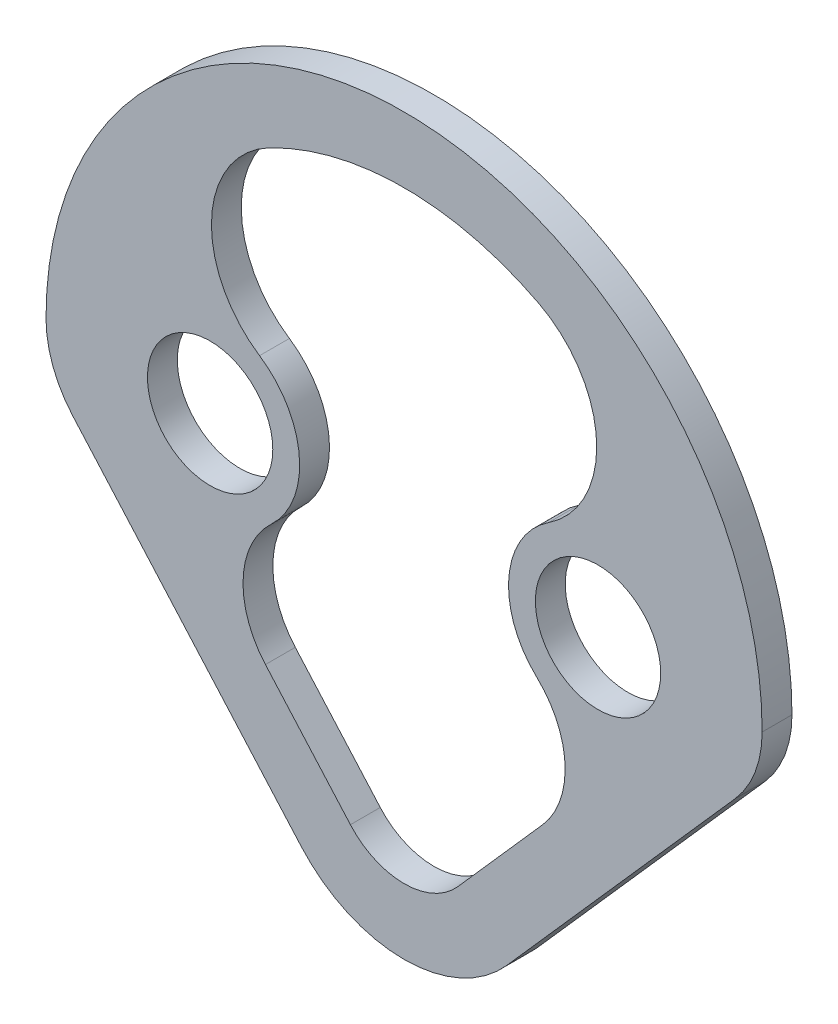
ISO-10303-21;
HEADER;
FILE_DESCRIPTION(('STEP AP214'),'2;1');
FILE_NAME('part.step','',(''),(''),'','','');
FILE_SCHEMA(('AUTOMOTIVE_DESIGN { 1 0 10303 214 1 1 1 1 }'));
ENDSEC;
DATA;
#1=APPLICATION_CONTEXT('core data for automotive mechanical design processes');
#2=APPLICATION_PROTOCOL_DEFINITION('international standard','automotive_design',2000,#1);
#3=PRODUCT_CONTEXT('',#1,'mechanical');
#4=PRODUCT('Part','Part','',(#3));
#5=PRODUCT_RELATED_PRODUCT_CATEGORY('part','',(#4));
#6=PRODUCT_DEFINITION_FORMATION('','',#4);
#7=PRODUCT_DEFINITION_CONTEXT('part definition',#1,'design');
#8=PRODUCT_DEFINITION('design','',#6,#7);
#9=PRODUCT_DEFINITION_SHAPE('','',#8);
#10=(LENGTH_UNIT() NAMED_UNIT(*) SI_UNIT(.MILLI.,.METRE.));
#11=(NAMED_UNIT(*) PLANE_ANGLE_UNIT() SI_UNIT($,.RADIAN.));
#12=(NAMED_UNIT(*) SI_UNIT($,.STERADIAN.) SOLID_ANGLE_UNIT());
#13=UNCERTAINTY_MEASURE_WITH_UNIT(LENGTH_MEASURE(1.E-05),#10,'distance_accuracy_value','');
#14=(GEOMETRIC_REPRESENTATION_CONTEXT(3) GLOBAL_UNCERTAINTY_ASSIGNED_CONTEXT((#13)) GLOBAL_UNIT_ASSIGNED_CONTEXT((#10,
#11,#12)) REPRESENTATION_CONTEXT('',''));
#15=CARTESIAN_POINT('',(0.,0.,0.));
#16=DIRECTION('',(0.,0.,1.));
#17=DIRECTION('',(1.,0.,0.));
#18=AXIS2_PLACEMENT_3D('',#15,#16,#17);
#19=CARTESIAN_POINT('',(0.,0.,5.));
#20=DIRECTION('',(0.,0.,1.));
#21=DIRECTION('',(1.,0.,0.));
#22=AXIS2_PLACEMENT_3D('',#19,#20,#21);
#23=PLANE('',#22);
#24=CARTESIAN_POINT('',(-32.5,40.,5.));
#25=DIRECTION('',(0.,0.,1.));
#26=DIRECTION('',(1.,0.,0.));
#27=AXIS2_PLACEMENT_3D('',#24,#25,#26);
#28=CIRCLE('',#27,10.5);
#29=CARTESIAN_POINT('',(-22.,40.,5.));
#30=VERTEX_POINT('',#29);
#31=EDGE_CURVE('E274',#30,#30,#28,.T.);
#32=ORIENTED_EDGE('',*,*,#31,.F.);
#33=EDGE_LOOP('',(#32));
#34=FACE_BOUND('',#33,.T.);
#35=CARTESIAN_POINT('',(0.,0.,5.));
#36=DIRECTION('',(0.,0.,1.));
#37=DIRECTION('',(1.,0.,0.));
#38=AXIS2_PLACEMENT_3D('',#35,#36,#37);
#39=CIRCLE('',#38,23.);
#40=CARTESIAN_POINT('',(-17.2388092700811,-15.2257497335851,5.));
#41=VERTEX_POINT('',#40);
#42=CARTESIAN_POINT('',(17.2388092700811,-15.2257497335851,5.));
#43=VERTEX_POINT('',#42);
#44=EDGE_CURVE('E282',#41,#43,#39,.T.);
#45=ORIENTED_EDGE('',*,*,#44,.T.);
#46=DIRECTION('',(0.661989118851527,0.749513446525264,0.));
#47=VECTOR('',#46,1.);
#48=CARTESIAN_POINT('',(17.2388092700811,-15.2257497335851,5.));
#49=LINE('',#48,#47);
#50=CARTESIAN_POINT('',(55.4912420374548,28.0841958606725,5.));
#51=VERTEX_POINT('',#50);
#52=EDGE_CURVE('E286',#43,#51,#49,.T.);
#53=ORIENTED_EDGE('',*,*,#52,.T.);
#54=CARTESIAN_POINT('',(42.0000000000007,39.9999999999997,5.));
#55=DIRECTION('',(0.,0.,1.));
#56=DIRECTION('',(-1.,0.,0.));
#57=AXIS2_PLACEMENT_3D('',#54,#55,#56);
#58=CIRCLE('',#57,17.9999999999993);
#59=CARTESIAN_POINT('',(60.,40.,5.));
#60=VERTEX_POINT('',#59);
#61=EDGE_CURVE('E290',#51,#60,#58,.T.);
#62=ORIENTED_EDGE('',*,*,#61,.T.);
#63=CARTESIAN_POINT('',(0.,40.,5.));
#64=DIRECTION('',(0.,0.,1.));
#65=DIRECTION('',(-1.,0.,0.));
#66=AXIS2_PLACEMENT_3D('',#63,#64,#65);
#67=CIRCLE('',#66,60.);
#68=CARTESIAN_POINT('',(-60.,40.,5.));
#69=VERTEX_POINT('',#68);
#70=EDGE_CURVE('E293',#60,#69,#67,.T.);
#71=ORIENTED_EDGE('',*,*,#70,.T.);
#72=CARTESIAN_POINT('',(-42.,40.,5.));
#73=DIRECTION('',(0.,0.,1.));
#74=DIRECTION('',(1.,0.,0.));
#75=AXIS2_PLACEMENT_3D('',#72,#73,#74);
#76=CIRCLE('',#75,18.);
#77=CARTESIAN_POINT('',(-55.4912420374547,28.0841958606725,5.));
#78=VERTEX_POINT('',#77);
#79=EDGE_CURVE('E296',#69,#78,#76,.T.);
#80=ORIENTED_EDGE('',*,*,#79,.T.);
#81=DIRECTION('',(0.661989118851527,-0.749513446525264,0.));
#82=VECTOR('',#81,1.);
#83=CARTESIAN_POINT('',(-17.2388092700811,-15.2257497335851,5.));
#84=LINE('',#83,#82);
#85=EDGE_CURVE('E299',#78,#41,#84,.T.);
#86=ORIENTED_EDGE('',*,*,#85,.T.);
#87=EDGE_LOOP('',(#45,#53,#62,#71,#80,#86));
#88=FACE_BOUND('',#87,.T.);
#89=CARTESIAN_POINT('',(32.5,40.,5.));
#90=DIRECTION('',(0.,0.,1.));
#91=DIRECTION('',(1.,0.,0.));
#92=AXIS2_PLACEMENT_3D('',#89,#90,#91);
#93=CIRCLE('',#92,10.5);
#94=CARTESIAN_POINT('',(43.,40.,5.));
#95=VERTEX_POINT('',#94);
#96=EDGE_CURVE('E266',#95,#95,#93,.T.);
#97=ORIENTED_EDGE('',*,*,#96,.F.);
#98=EDGE_LOOP('',(#97));
#99=FACE_BOUND('',#98,.T.);
#100=DIRECTION('',(0.661989118851527,-0.749513446525264,0.));
#101=VECTOR('',#100,1.);
#102=CARTESIAN_POINT('',(-23.232277996995,8.17672768028504,5.));
#103=LINE('',#102,#101);
#104=CARTESIAN_POINT('',(-23.232277996995,8.17672768028504,5.));
#105=VERTEX_POINT('',#104);
#106=CARTESIAN_POINT('',(-8.99416135830316,-7.94386942621832,5.));
#107=VERTEX_POINT('',#106);
#108=EDGE_CURVE('E166',#105,#107,#103,.T.);
#109=ORIENTED_EDGE('',*,*,#108,.F.);
#110=CARTESIAN_POINT('',(-11.9895762991161,18.1065644630579,5.));
#111=DIRECTION('',(0.,0.,1.));
#112=DIRECTION('',(1.,0.,0.));
#113=AXIS2_PLACEMENT_3D('',#110,#111,#112);
#114=CIRCLE('',#113,15.);
#115=CARTESIAN_POINT('',(-22.2447881495579,29.0532822315289,5.));
#116=VERTEX_POINT('',#115);
#117=EDGE_CURVE('E157',#116,#105,#114,.T.);
#118=ORIENTED_EDGE('',*,*,#117,.F.);
#119=CARTESIAN_POINT('',(-32.5,40.,5.));
#120=DIRECTION('',(0.,0.,-1.));
#121=DIRECTION('',(-1.,0.,0.));
#122=AXIS2_PLACEMENT_3D('',#119,#120,#121);
#123=CIRCLE('',#122,15.0000000000003);
#124=CARTESIAN_POINT('',(-24.2185314685311,52.5066893685859,5.));
#125=VERTEX_POINT('',#124);
#126=EDGE_CURVE('E204',#125,#116,#123,.T.);
#127=ORIENTED_EDGE('',*,*,#126,.F.);
#128=CARTESIAN_POINT('',(-14.2807692307686,67.514716610889,5.));
#129=DIRECTION('',(0.,0.,1.));
#130=DIRECTION('',(1.,0.,0.));
#131=AXIS2_PLACEMENT_3D('',#128,#129,#130);
#132=CIRCLE('',#131,18.0000000000003);
#133=CARTESIAN_POINT('',(-22.5728287841183,83.4910036752761,5.));
#134=VERTEX_POINT('',#133);
#135=EDGE_CURVE('E201',#134,#125,#132,.T.);
#136=ORIENTED_EDGE('',*,*,#135,.F.);
#137=CARTESIAN_POINT('',(0.,40.,5.));
#138=DIRECTION('',(0.,0.,1.));
#139=DIRECTION('',(1.,0.,0.));
#140=AXIS2_PLACEMENT_3D('',#137,#138,#139);
#141=CIRCLE('',#140,49.);
#142=CARTESIAN_POINT('',(22.572828784114,83.4910036752783,5.));
#143=VERTEX_POINT('',#142);
#144=EDGE_CURVE('E198',#143,#134,#141,.T.);
#145=ORIENTED_EDGE('',*,*,#144,.F.);
#146=CARTESIAN_POINT('',(14.2807692307654,67.5147166108893,5.));
#147=DIRECTION('',(0.,0.,1.));
#148=DIRECTION('',(1.,0.,0.));
#149=AXIS2_PLACEMENT_3D('',#146,#147,#148);
#150=CIRCLE('',#149,18.0000000000012);
#151=CARTESIAN_POINT('',(24.2185314685307,52.5066893685869,5.));
#152=VERTEX_POINT('',#151);
#153=EDGE_CURVE('E195',#152,#143,#150,.T.);
#154=ORIENTED_EDGE('',*,*,#153,.F.);
#155=CARTESIAN_POINT('',(32.5,40.,5.));
#156=DIRECTION('',(0.,0.,-1.));
#157=DIRECTION('',(-1.,0.,0.));
#158=AXIS2_PLACEMENT_3D('',#155,#156,#157);
#159=CIRCLE('',#158,15.0000000000014);
#160=CARTESIAN_POINT('',(22.2447881495545,29.0532822315304,5.));
#161=VERTEX_POINT('',#160);
#162=EDGE_CURVE('E192',#161,#152,#159,.T.);
#163=ORIENTED_EDGE('',*,*,#162,.F.);
#164=CARTESIAN_POINT('',(11.98957629911,18.1065644630619,5.));
#165=DIRECTION('',(0.,0.,1.));
#166=DIRECTION('',(-1.,0.,0.));
#167=AXIS2_PLACEMENT_3D('',#164,#165,#166);
#168=CIRCLE('',#167,15.);
#169=CARTESIAN_POINT('',(23.2322779969923,8.1767276802928,5.));
#170=VERTEX_POINT('',#169);
#171=EDGE_CURVE('E189',#170,#161,#168,.T.);
#172=ORIENTED_EDGE('',*,*,#171,.F.);
#173=DIRECTION('',(0.661989118851277,0.749513446525485,0.));
#174=VECTOR('',#173,1.);
#175=CARTESIAN_POINT('',(8.99416135830581,-7.94386942621531,5.));
#176=LINE('',#175,#174);
#177=CARTESIAN_POINT('',(8.99416135830582,-7.94386942621533,5.));
#178=VERTEX_POINT('',#177);
#179=EDGE_CURVE('E184',#178,#170,#176,.T.);
#180=ORIENTED_EDGE('',*,*,#179,.F.);
#181=CARTESIAN_POINT('',(0.,0.,5.));
#182=DIRECTION('',(0.,0.,1.));
#183=DIRECTION('',(1.,0.,0.));
#184=AXIS2_PLACEMENT_3D('',#181,#182,#183);
#185=CIRCLE('',#184,12.);
#186=EDGE_CURVE('E180',#107,#178,#185,.T.);
#187=ORIENTED_EDGE('',*,*,#186,.F.);
#188=EDGE_LOOP('',(#109,#118,#127,#136,#145,#154,#163,#172,#180,#187));
#189=FACE_BOUND('',#188,.T.);
#190=ADVANCED_FACE('F43',(#34,#88,#99,#189),#23,.T.);
#191=CARTESIAN_POINT('',(0.,0.,0.));
#192=DIRECTION('',(0.,0.,1.));
#193=DIRECTION('',(1.,0.,0.));
#194=AXIS2_PLACEMENT_3D('',#191,#192,#193);
#195=PLANE('',#194);
#196=CARTESIAN_POINT('',(32.5,40.,0.));
#197=DIRECTION('',(0.,0.,1.));
#198=DIRECTION('',(1.,0.,0.));
#199=AXIS2_PLACEMENT_3D('',#196,#197,#198);
#200=CIRCLE('',#199,10.5);
#201=CARTESIAN_POINT('',(43.,40.,0.));
#202=VERTEX_POINT('',#201);
#203=EDGE_CURVE('E175',#202,#202,#200,.T.);
#204=ORIENTED_EDGE('',*,*,#203,.T.);
#205=EDGE_LOOP('',(#204));
#206=FACE_BOUND('',#205,.T.);
#207=CARTESIAN_POINT('',(-32.5,40.,0.));
#208=DIRECTION('',(0.,0.,1.));
#209=DIRECTION('',(1.,0.,0.));
#210=AXIS2_PLACEMENT_3D('',#207,#208,#209);
#211=CIRCLE('',#210,10.5);
#212=CARTESIAN_POINT('',(-22.,40.,0.));
#213=VERTEX_POINT('',#212);
#214=EDGE_CURVE('E270',#213,#213,#211,.T.);
#215=ORIENTED_EDGE('',*,*,#214,.T.);
#216=EDGE_LOOP('',(#215));
#217=FACE_BOUND('',#216,.T.);
#218=CARTESIAN_POINT('',(0.,0.,0.));
#219=DIRECTION('',(0.,0.,1.));
#220=DIRECTION('',(1.,0.,0.));
#221=AXIS2_PLACEMENT_3D('',#218,#219,#220);
#222=CIRCLE('',#221,23.);
#223=CARTESIAN_POINT('',(-17.2388092700811,-15.2257497335851,0.));
#224=VERTEX_POINT('',#223);
#225=CARTESIAN_POINT('',(17.2388092700811,-15.2257497335851,0.));
#226=VERTEX_POINT('',#225);
#227=EDGE_CURVE('E278',#224,#226,#222,.T.);
#228=ORIENTED_EDGE('',*,*,#227,.F.);
#229=DIRECTION('',(0.661989118851527,-0.749513446525264,0.));
#230=VECTOR('',#229,1.);
#231=CARTESIAN_POINT('',(-17.2388092700811,-15.2257497335851,0.));
#232=LINE('',#231,#230);
#233=CARTESIAN_POINT('',(-55.4912420374547,28.0841958606725,0.));
#234=VERTEX_POINT('',#233);
#235=EDGE_CURVE('E287',#234,#224,#232,.T.);
#236=ORIENTED_EDGE('',*,*,#235,.F.);
#237=CARTESIAN_POINT('',(-42.,40.,0.));
#238=DIRECTION('',(0.,0.,1.));
#239=DIRECTION('',(1.,0.,0.));
#240=AXIS2_PLACEMENT_3D('',#237,#238,#239);
#241=CIRCLE('',#240,18.);
#242=CARTESIAN_POINT('',(-60.,40.,0.));
#243=VERTEX_POINT('',#242);
#244=EDGE_CURVE('E315',#243,#234,#241,.T.);
#245=ORIENTED_EDGE('',*,*,#244,.F.);
#246=CARTESIAN_POINT('',(0.,40.,0.));
#247=DIRECTION('',(0.,0.,1.));
#248=DIRECTION('',(-1.,0.,0.));
#249=AXIS2_PLACEMENT_3D('',#246,#247,#248);
#250=CIRCLE('',#249,60.);
#251=CARTESIAN_POINT('',(60.,40.,0.));
#252=VERTEX_POINT('',#251);
#253=EDGE_CURVE('E312',#252,#243,#250,.T.);
#254=ORIENTED_EDGE('',*,*,#253,.F.);
#255=CARTESIAN_POINT('',(42.0000000000007,39.9999999999997,0.));
#256=DIRECTION('',(0.,0.,1.));
#257=DIRECTION('',(-1.,0.,0.));
#258=AXIS2_PLACEMENT_3D('',#255,#256,#257);
#259=CIRCLE('',#258,17.9999999999993);
#260=CARTESIAN_POINT('',(55.4912420374548,28.0841958606725,0.));
#261=VERTEX_POINT('',#260);
#262=EDGE_CURVE('E309',#261,#252,#259,.T.);
#263=ORIENTED_EDGE('',*,*,#262,.F.);
#264=DIRECTION('',(0.661989118851527,0.749513446525264,0.));
#265=VECTOR('',#264,1.);
#266=CARTESIAN_POINT('',(17.2388092700811,-15.2257497335851,0.));
#267=LINE('',#266,#265);
#268=EDGE_CURVE('E306',#226,#261,#267,.T.);
#269=ORIENTED_EDGE('',*,*,#268,.F.);
#270=EDGE_LOOP('',(#228,#236,#245,#254,#263,#269));
#271=FACE_BOUND('',#270,.T.);
#272=CARTESIAN_POINT('',(-11.9895762991161,18.1065644630579,0.));
#273=DIRECTION('',(0.,0.,1.));
#274=DIRECTION('',(1.,0.,0.));
#275=AXIS2_PLACEMENT_3D('',#272,#273,#274);
#276=CIRCLE('',#275,15.);
#277=CARTESIAN_POINT('',(-22.2447881495579,29.0532822315289,0.));
#278=VERTEX_POINT('',#277);
#279=CARTESIAN_POINT('',(-23.232277996995,8.17672768028504,0.));
#280=VERTEX_POINT('',#279);
#281=EDGE_CURVE('E67',#278,#280,#276,.T.);
#282=ORIENTED_EDGE('',*,*,#281,.T.);
#283=DIRECTION('',(0.661989118851527,-0.749513446525264,0.));
#284=VECTOR('',#283,1.);
#285=CARTESIAN_POINT('',(-23.232277996995,8.17672768028504,0.));
#286=LINE('',#285,#284);
#287=CARTESIAN_POINT('',(-8.99416135830316,-7.94386942621832,0.));
#288=VERTEX_POINT('',#287);
#289=EDGE_CURVE('E173',#280,#288,#286,.T.);
#290=ORIENTED_EDGE('',*,*,#289,.T.);
#291=CARTESIAN_POINT('',(0.,0.,0.));
#292=DIRECTION('',(0.,0.,1.));
#293=DIRECTION('',(1.,0.,0.));
#294=AXIS2_PLACEMENT_3D('',#291,#292,#293);
#295=CIRCLE('',#294,12.);
#296=CARTESIAN_POINT('',(8.99416135830582,-7.94386942621533,0.));
#297=VERTEX_POINT('',#296);
#298=EDGE_CURVE('E211',#288,#297,#295,.T.);
#299=ORIENTED_EDGE('',*,*,#298,.T.);
#300=DIRECTION('',(0.661989118851277,0.749513446525485,0.));
#301=VECTOR('',#300,1.);
#302=CARTESIAN_POINT('',(8.99416135830581,-7.94386942621531,0.));
#303=LINE('',#302,#301);
#304=CARTESIAN_POINT('',(23.2322779969923,8.1767276802928,0.));
#305=VERTEX_POINT('',#304);
#306=EDGE_CURVE('E215',#297,#305,#303,.T.);
#307=ORIENTED_EDGE('',*,*,#306,.T.);
#308=CARTESIAN_POINT('',(11.98957629911,18.1065644630619,0.));
#309=DIRECTION('',(0.,0.,1.));
#310=DIRECTION('',(-1.,0.,0.));
#311=AXIS2_PLACEMENT_3D('',#308,#309,#310);
#312=CIRCLE('',#311,15.);
#313=CARTESIAN_POINT('',(22.2447881495545,29.0532822315304,0.));
#314=VERTEX_POINT('',#313);
#315=EDGE_CURVE('E219',#305,#314,#312,.T.);
#316=ORIENTED_EDGE('',*,*,#315,.T.);
#317=CARTESIAN_POINT('',(32.5,40.,0.));
#318=DIRECTION('',(0.,0.,-1.));
#319=DIRECTION('',(-1.,0.,0.));
#320=AXIS2_PLACEMENT_3D('',#317,#318,#319);
#321=CIRCLE('',#320,15.0000000000014);
#322=CARTESIAN_POINT('',(24.2185314685307,52.5066893685869,0.));
#323=VERTEX_POINT('',#322);
#324=EDGE_CURVE('E223',#314,#323,#321,.T.);
#325=ORIENTED_EDGE('',*,*,#324,.T.);
#326=CARTESIAN_POINT('',(14.2807692307654,67.5147166108893,0.));
#327=DIRECTION('',(0.,0.,1.));
#328=DIRECTION('',(1.,0.,0.));
#329=AXIS2_PLACEMENT_3D('',#326,#327,#328);
#330=CIRCLE('',#329,18.0000000000012);
#331=CARTESIAN_POINT('',(22.572828784114,83.4910036752783,0.));
#332=VERTEX_POINT('',#331);
#333=EDGE_CURVE('E227',#323,#332,#330,.T.);
#334=ORIENTED_EDGE('',*,*,#333,.T.);
#335=CARTESIAN_POINT('',(0.,40.,0.));
#336=DIRECTION('',(0.,0.,1.));
#337=DIRECTION('',(1.,0.,0.));
#338=AXIS2_PLACEMENT_3D('',#335,#336,#337);
#339=CIRCLE('',#338,49.);
#340=CARTESIAN_POINT('',(-22.5728287841183,83.4910036752761,0.));
#341=VERTEX_POINT('',#340);
#342=EDGE_CURVE('E231',#332,#341,#339,.T.);
#343=ORIENTED_EDGE('',*,*,#342,.T.);
#344=CARTESIAN_POINT('',(-14.2807692307686,67.514716610889,0.));
#345=DIRECTION('',(0.,0.,1.));
#346=DIRECTION('',(1.,0.,0.));
#347=AXIS2_PLACEMENT_3D('',#344,#345,#346);
#348=CIRCLE('',#347,18.0000000000003);
#349=CARTESIAN_POINT('',(-24.2185314685311,52.5066893685859,0.));
#350=VERTEX_POINT('',#349);
#351=EDGE_CURVE('E235',#341,#350,#348,.T.);
#352=ORIENTED_EDGE('',*,*,#351,.T.);
#353=CARTESIAN_POINT('',(-32.5,40.,0.));
#354=DIRECTION('',(0.,0.,-1.));
#355=DIRECTION('',(-1.,0.,0.));
#356=AXIS2_PLACEMENT_3D('',#353,#354,#355);
#357=CIRCLE('',#356,15.0000000000003);
#358=EDGE_CURVE('E167',#350,#278,#357,.T.);
#359=ORIENTED_EDGE('',*,*,#358,.T.);
#360=EDGE_LOOP('',(#282,#290,#299,#307,#316,#325,#334,#343,#352,#359));
#361=FACE_BOUND('',#360,.T.);
#362=ADVANCED_FACE('F346',(#206,#217,#271,#361),#195,.F.);
#363=CARTESIAN_POINT('',(0.,0.,5.));
#364=DIRECTION('',(0.,0.,-1.));
#365=DIRECTION('',(-1.,0.,0.));
#366=AXIS2_PLACEMENT_3D('',#363,#364,#365);
#367=CYLINDRICAL_SURFACE('',#366,23.);
#368=ORIENTED_EDGE('',*,*,#227,.T.);
#369=DIRECTION('',(0.,0.,-1.));
#370=VECTOR('',#369,1.);
#371=CARTESIAN_POINT('',(17.2388092700811,-15.2257497335851,5.));
#372=LINE('',#371,#370);
#373=EDGE_CURVE('E11',#43,#226,#372,.T.);
#374=ORIENTED_EDGE('',*,*,#373,.F.);
#375=ORIENTED_EDGE('',*,*,#44,.F.);
#376=DIRECTION('',(0.,0.,-1.));
#377=VECTOR('',#376,1.);
#378=CARTESIAN_POINT('',(-17.2388092700811,-15.2257497335851,5.));
#379=LINE('',#378,#377);
#380=EDGE_CURVE('E302',#41,#224,#379,.T.);
#381=ORIENTED_EDGE('',*,*,#380,.T.);
#382=EDGE_LOOP('',(#368,#374,#375,#381));
#383=FACE_BOUND('',#382,.T.);
#384=ADVANCED_FACE('F45',(#383),#367,.T.);
#385=CARTESIAN_POINT('',(17.2388092700811,-15.2257497335851,5.));
#386=DIRECTION('',(-0.749513446525263,0.661989118851527,0.));
#387=DIRECTION('',(-0.661989118851527,-0.749513446525264,0.));
#388=AXIS2_PLACEMENT_3D('',#385,#386,#387);
#389=PLANE('',#388);
#390=ORIENTED_EDGE('',*,*,#268,.T.);
#391=DIRECTION('',(0.,0.,-1.));
#392=VECTOR('',#391,1.);
#393=CARTESIAN_POINT('',(55.4912420374548,28.0841958606725,5.));
#394=LINE('',#393,#392);
#395=EDGE_CURVE('E52',#51,#261,#394,.T.);
#396=ORIENTED_EDGE('',*,*,#395,.F.);
#397=ORIENTED_EDGE('',*,*,#52,.F.);
#398=ORIENTED_EDGE('',*,*,#373,.T.);
#399=EDGE_LOOP('',(#390,#396,#397,#398));
#400=FACE_BOUND('',#399,.T.);
#401=ADVANCED_FACE('F364',(#400),#389,.F.);
#402=CARTESIAN_POINT('',(42.0000000000007,39.9999999999997,5.));
#403=DIRECTION('',(0.,0.,-1.));
#404=DIRECTION('',(-1.,0.,0.));
#405=AXIS2_PLACEMENT_3D('',#402,#403,#404);
#406=CYLINDRICAL_SURFACE('',#405,17.9999999999993);
#407=ORIENTED_EDGE('',*,*,#262,.T.);
#408=DIRECTION('',(0.,0.,-1.));
#409=VECTOR('',#408,1.);
#410=CARTESIAN_POINT('',(60.,40.,5.));
#411=LINE('',#410,#409);
#412=EDGE_CURVE('E331',#60,#252,#411,.T.);
#413=ORIENTED_EDGE('',*,*,#412,.F.);
#414=ORIENTED_EDGE('',*,*,#61,.F.);
#415=ORIENTED_EDGE('',*,*,#395,.T.);
#416=EDGE_LOOP('',(#407,#413,#414,#415));
#417=FACE_BOUND('',#416,.T.);
#418=ADVANCED_FACE('F340',(#417),#406,.T.);
#419=CARTESIAN_POINT('',(0.,40.,5.));
#420=DIRECTION('',(0.,0.,-1.));
#421=DIRECTION('',(-1.,0.,0.));
#422=AXIS2_PLACEMENT_3D('',#419,#420,#421);
#423=CYLINDRICAL_SURFACE('',#422,60.);
#424=ORIENTED_EDGE('',*,*,#253,.T.);
#425=DIRECTION('',(0.,0.,-1.));
#426=VECTOR('',#425,1.);
#427=CARTESIAN_POINT('',(-60.,40.,5.));
#428=LINE('',#427,#426);
#429=EDGE_CURVE('E327',#69,#243,#428,.T.);
#430=ORIENTED_EDGE('',*,*,#429,.F.);
#431=ORIENTED_EDGE('',*,*,#70,.F.);
#432=ORIENTED_EDGE('',*,*,#412,.T.);
#433=EDGE_LOOP('',(#424,#430,#431,#432));
#434=FACE_BOUND('',#433,.T.);
#435=ADVANCED_FACE('F352',(#434),#423,.T.);
#436=CARTESIAN_POINT('',(-42.,40.,5.));
#437=DIRECTION('',(0.,0.,-1.));
#438=DIRECTION('',(-1.,0.,0.));
#439=AXIS2_PLACEMENT_3D('',#436,#437,#438);
#440=CYLINDRICAL_SURFACE('',#439,18.);
#441=ORIENTED_EDGE('',*,*,#244,.T.);
#442=DIRECTION('',(0.,0.,-1.));
#443=VECTOR('',#442,1.);
#444=CARTESIAN_POINT('',(-55.4912420374547,28.0841958606725,5.));
#445=LINE('',#444,#443);
#446=EDGE_CURVE('E323',#78,#234,#445,.T.);
#447=ORIENTED_EDGE('',*,*,#446,.F.);
#448=ORIENTED_EDGE('',*,*,#79,.F.);
#449=ORIENTED_EDGE('',*,*,#429,.T.);
#450=EDGE_LOOP('',(#441,#447,#448,#449));
#451=FACE_BOUND('',#450,.T.);
#452=ADVANCED_FACE('F356',(#451),#440,.T.);
#453=CARTESIAN_POINT('',(-17.2388092700811,-15.2257497335851,5.));
#454=DIRECTION('',(0.749513446525264,0.661989118851527,0.));
#455=DIRECTION('',(-0.661989118851527,0.749513446525264,0.));
#456=AXIS2_PLACEMENT_3D('',#453,#454,#455);
#457=PLANE('',#456);
#458=ORIENTED_EDGE('',*,*,#235,.T.);
#459=ORIENTED_EDGE('',*,*,#380,.F.);
#460=ORIENTED_EDGE('',*,*,#85,.F.);
#461=ORIENTED_EDGE('',*,*,#446,.T.);
#462=EDGE_LOOP('',(#458,#459,#460,#461));
#463=FACE_BOUND('',#462,.T.);
#464=ADVANCED_FACE('F367',(#463),#457,.F.);
#465=CARTESIAN_POINT('',(-32.5,40.,5.));
#466=DIRECTION('',(0.,0.,-1.));
#467=DIRECTION('',(-1.,0.,0.));
#468=AXIS2_PLACEMENT_3D('',#465,#466,#467);
#469=CYLINDRICAL_SURFACE('',#468,10.5);
#470=ORIENTED_EDGE('',*,*,#31,.T.);
#471=EDGE_LOOP('',(#470));
#472=FACE_BOUND('',#471,.T.);
#473=ORIENTED_EDGE('',*,*,#214,.F.);
#474=EDGE_LOOP('',(#473));
#475=FACE_BOUND('',#474,.T.);
#476=ADVANCED_FACE('F369',(#472,#475),#469,.F.);
#477=CARTESIAN_POINT('',(32.5,40.,5.));
#478=DIRECTION('',(0.,0.,-1.));
#479=DIRECTION('',(-1.,0.,0.));
#480=AXIS2_PLACEMENT_3D('',#477,#478,#479);
#481=CYLINDRICAL_SURFACE('',#480,10.5);
#482=ORIENTED_EDGE('',*,*,#96,.T.);
#483=EDGE_LOOP('',(#482));
#484=FACE_BOUND('',#483,.T.);
#485=ORIENTED_EDGE('',*,*,#203,.F.);
#486=EDGE_LOOP('',(#485));
#487=FACE_BOUND('',#486,.T.);
#488=ADVANCED_FACE('F375',(#484,#487),#481,.F.);
#489=CARTESIAN_POINT('',(-11.9895762991161,18.1065644630579,5.));
#490=DIRECTION('',(0.,0.,-1.));
#491=DIRECTION('',(-1.,0.,0.));
#492=AXIS2_PLACEMENT_3D('',#489,#490,#491);
#493=CYLINDRICAL_SURFACE('',#492,15.);
#494=ORIENTED_EDGE('',*,*,#281,.F.);
#495=DIRECTION('',(0.,0.,-1.));
#496=VECTOR('',#495,1.);
#497=CARTESIAN_POINT('',(-22.2447881495579,29.0532822315289,5.));
#498=LINE('',#497,#496);
#499=EDGE_CURVE('E161',#116,#278,#498,.T.);
#500=ORIENTED_EDGE('',*,*,#499,.F.);
#501=ORIENTED_EDGE('',*,*,#117,.T.);
#502=DIRECTION('',(0.,0.,-1.));
#503=VECTOR('',#502,1.);
#504=CARTESIAN_POINT('',(-23.232277996995,8.17672768028504,5.));
#505=LINE('',#504,#503);
#506=EDGE_CURVE('E160',#105,#280,#505,.T.);
#507=ORIENTED_EDGE('',*,*,#506,.T.);
#508=EDGE_LOOP('',(#494,#500,#501,#507));
#509=FACE_BOUND('',#508,.T.);
#510=ADVANCED_FACE('F159',(#509),#493,.F.);
#511=CARTESIAN_POINT('',(-23.232277996995,8.17672768028504,5.));
#512=DIRECTION('',(0.749513446525264,0.661989118851527,0.));
#513=DIRECTION('',(-0.661989118851527,0.749513446525264,0.));
#514=AXIS2_PLACEMENT_3D('',#511,#512,#513);
#515=PLANE('',#514);
#516=ORIENTED_EDGE('',*,*,#289,.F.);
#517=ORIENTED_EDGE('',*,*,#506,.F.);
#518=ORIENTED_EDGE('',*,*,#108,.T.);
#519=DIRECTION('',(0.,0.,-1.));
#520=VECTOR('',#519,1.);
#521=CARTESIAN_POINT('',(-8.99416135830316,-7.94386942621832,5.));
#522=LINE('',#521,#520);
#523=EDGE_CURVE('E176',#107,#288,#522,.T.);
#524=ORIENTED_EDGE('',*,*,#523,.T.);
#525=EDGE_LOOP('',(#516,#517,#518,#524));
#526=FACE_BOUND('',#525,.T.);
#527=ADVANCED_FACE('F170',(#526),#515,.T.);
#528=CARTESIAN_POINT('',(0.,0.,5.));
#529=DIRECTION('',(0.,0.,-1.));
#530=DIRECTION('',(-1.,0.,0.));
#531=AXIS2_PLACEMENT_3D('',#528,#529,#530);
#532=CYLINDRICAL_SURFACE('',#531,12.);
#533=ORIENTED_EDGE('',*,*,#298,.F.);
#534=ORIENTED_EDGE('',*,*,#523,.F.);
#535=ORIENTED_EDGE('',*,*,#186,.T.);
#536=DIRECTION('',(0.,0.,-1.));
#537=VECTOR('',#536,1.);
#538=CARTESIAN_POINT('',(8.99416135830582,-7.94386942621533,5.));
#539=LINE('',#538,#537);
#540=EDGE_CURVE('E261',#178,#297,#539,.T.);
#541=ORIENTED_EDGE('',*,*,#540,.T.);
#542=EDGE_LOOP('',(#533,#534,#535,#541));
#543=FACE_BOUND('',#542,.T.);
#544=ADVANCED_FACE('F396',(#543),#532,.F.);
#545=CARTESIAN_POINT('',(8.99416135830581,-7.94386942621531,5.));
#546=DIRECTION('',(-0.749513446525484,0.661989118851277,0.));
#547=DIRECTION('',(-0.661989118851277,-0.749513446525484,0.));
#548=AXIS2_PLACEMENT_3D('',#545,#546,#547);
#549=PLANE('',#548);
#550=ORIENTED_EDGE('',*,*,#306,.F.);
#551=ORIENTED_EDGE('',*,*,#540,.F.);
#552=ORIENTED_EDGE('',*,*,#179,.T.);
#553=DIRECTION('',(0.,0.,-1.));
#554=VECTOR('',#553,1.);
#555=CARTESIAN_POINT('',(23.2322779969923,8.1767276802928,5.));
#556=LINE('',#555,#554);
#557=EDGE_CURVE('E258',#170,#305,#556,.T.);
#558=ORIENTED_EDGE('',*,*,#557,.T.);
#559=EDGE_LOOP('',(#550,#551,#552,#558));
#560=FACE_BOUND('',#559,.T.);
#561=ADVANCED_FACE('F399',(#560),#549,.T.);
#562=CARTESIAN_POINT('',(11.98957629911,18.1065644630619,5.));
#563=DIRECTION('',(0.,0.,-1.));
#564=DIRECTION('',(-1.,0.,0.));
#565=AXIS2_PLACEMENT_3D('',#562,#563,#564);
#566=CYLINDRICAL_SURFACE('',#565,15.);
#567=ORIENTED_EDGE('',*,*,#315,.F.);
#568=ORIENTED_EDGE('',*,*,#557,.F.);
#569=ORIENTED_EDGE('',*,*,#171,.T.);
#570=DIRECTION('',(0.,0.,-1.));
#571=VECTOR('',#570,1.);
#572=CARTESIAN_POINT('',(22.2447881495545,29.0532822315304,5.));
#573=LINE('',#572,#571);
#574=EDGE_CURVE('E255',#161,#314,#573,.T.);
#575=ORIENTED_EDGE('',*,*,#574,.T.);
#576=EDGE_LOOP('',(#567,#568,#569,#575));
#577=FACE_BOUND('',#576,.T.);
#578=ADVANCED_FACE('F403',(#577),#566,.F.);
#579=CARTESIAN_POINT('',(32.5,40.,5.));
#580=DIRECTION('',(0.,0.,-1.));
#581=DIRECTION('',(-1.,0.,0.));
#582=AXIS2_PLACEMENT_3D('',#579,#580,#581);
#583=CYLINDRICAL_SURFACE('',#582,15.0000000000014);
#584=ORIENTED_EDGE('',*,*,#324,.F.);
#585=ORIENTED_EDGE('',*,*,#574,.F.);
#586=ORIENTED_EDGE('',*,*,#162,.T.);
#587=DIRECTION('',(0.,0.,-1.));
#588=VECTOR('',#587,1.);
#589=CARTESIAN_POINT('',(24.2185314685307,52.5066893685869,5.));
#590=LINE('',#589,#588);
#591=EDGE_CURVE('E252',#152,#323,#590,.T.);
#592=ORIENTED_EDGE('',*,*,#591,.T.);
#593=EDGE_LOOP('',(#584,#585,#586,#592));
#594=FACE_BOUND('',#593,.T.);
#595=ADVANCED_FACE('F407',(#594),#583,.T.);
#596=CARTESIAN_POINT('',(14.2807692307654,67.5147166108893,5.));
#597=DIRECTION('',(0.,0.,-1.));
#598=DIRECTION('',(-1.,0.,0.));
#599=AXIS2_PLACEMENT_3D('',#596,#597,#598);
#600=CYLINDRICAL_SURFACE('',#599,18.0000000000012);
#601=ORIENTED_EDGE('',*,*,#333,.F.);
#602=ORIENTED_EDGE('',*,*,#591,.F.);
#603=ORIENTED_EDGE('',*,*,#153,.T.);
#604=DIRECTION('',(0.,0.,-1.));
#605=VECTOR('',#604,1.);
#606=CARTESIAN_POINT('',(22.572828784114,83.4910036752783,5.));
#607=LINE('',#606,#605);
#608=EDGE_CURVE('E249',#143,#332,#607,.T.);
#609=ORIENTED_EDGE('',*,*,#608,.T.);
#610=EDGE_LOOP('',(#601,#602,#603,#609));
#611=FACE_BOUND('',#610,.T.);
#612=ADVANCED_FACE('F411',(#611),#600,.F.);
#613=CARTESIAN_POINT('',(0.,40.,5.));
#614=DIRECTION('',(0.,0.,-1.));
#615=DIRECTION('',(-1.,0.,0.));
#616=AXIS2_PLACEMENT_3D('',#613,#614,#615);
#617=CYLINDRICAL_SURFACE('',#616,49.);
#618=ORIENTED_EDGE('',*,*,#342,.F.);
#619=ORIENTED_EDGE('',*,*,#608,.F.);
#620=ORIENTED_EDGE('',*,*,#144,.T.);
#621=DIRECTION('',(0.,0.,-1.));
#622=VECTOR('',#621,1.);
#623=CARTESIAN_POINT('',(-22.5728287841183,83.4910036752761,5.));
#624=LINE('',#623,#622);
#625=EDGE_CURVE('E246',#134,#341,#624,.T.);
#626=ORIENTED_EDGE('',*,*,#625,.T.);
#627=EDGE_LOOP('',(#618,#619,#620,#626));
#628=FACE_BOUND('',#627,.T.);
#629=ADVANCED_FACE('F415',(#628),#617,.F.);
#630=CARTESIAN_POINT('',(-14.2807692307686,67.514716610889,5.));
#631=DIRECTION('',(0.,0.,-1.));
#632=DIRECTION('',(-1.,0.,0.));
#633=AXIS2_PLACEMENT_3D('',#630,#631,#632);
#634=CYLINDRICAL_SURFACE('',#633,18.0000000000003);
#635=ORIENTED_EDGE('',*,*,#351,.F.);
#636=ORIENTED_EDGE('',*,*,#625,.F.);
#637=ORIENTED_EDGE('',*,*,#135,.T.);
#638=DIRECTION('',(0.,0.,-1.));
#639=VECTOR('',#638,1.);
#640=CARTESIAN_POINT('',(-24.2185314685311,52.5066893685859,5.));
#641=LINE('',#640,#639);
#642=EDGE_CURVE('E59',#125,#350,#641,.T.);
#643=ORIENTED_EDGE('',*,*,#642,.T.);
#644=EDGE_LOOP('',(#635,#636,#637,#643));
#645=FACE_BOUND('',#644,.T.);
#646=ADVANCED_FACE('F419',(#645),#634,.F.);
#647=CARTESIAN_POINT('',(-32.5,40.,5.));
#648=DIRECTION('',(0.,0.,-1.));
#649=DIRECTION('',(-1.,0.,0.));
#650=AXIS2_PLACEMENT_3D('',#647,#648,#649);
#651=CYLINDRICAL_SURFACE('',#650,15.0000000000003);
#652=ORIENTED_EDGE('',*,*,#358,.F.);
#653=ORIENTED_EDGE('',*,*,#642,.F.);
#654=ORIENTED_EDGE('',*,*,#126,.T.);
#655=ORIENTED_EDGE('',*,*,#499,.T.);
#656=EDGE_LOOP('',(#652,#653,#654,#655));
#657=FACE_BOUND('',#656,.T.);
#658=ADVANCED_FACE('F423',(#657),#651,.T.);
#659=CLOSED_SHELL('',(#190,#362,#384,#401,#418,#435,#452,#464,#476,#488,#510,#527,#544,#561,
#578,#595,#612,#629,#646,#658));
#660=MANIFOLD_SOLID_BREP('B2',#659);
#661=ADVANCED_BREP_SHAPE_REPRESENTATION('',(#18,#660),#14);
#662=SHAPE_DEFINITION_REPRESENTATION(#9,#661);
ENDSEC;
END-ISO-10303-21;
